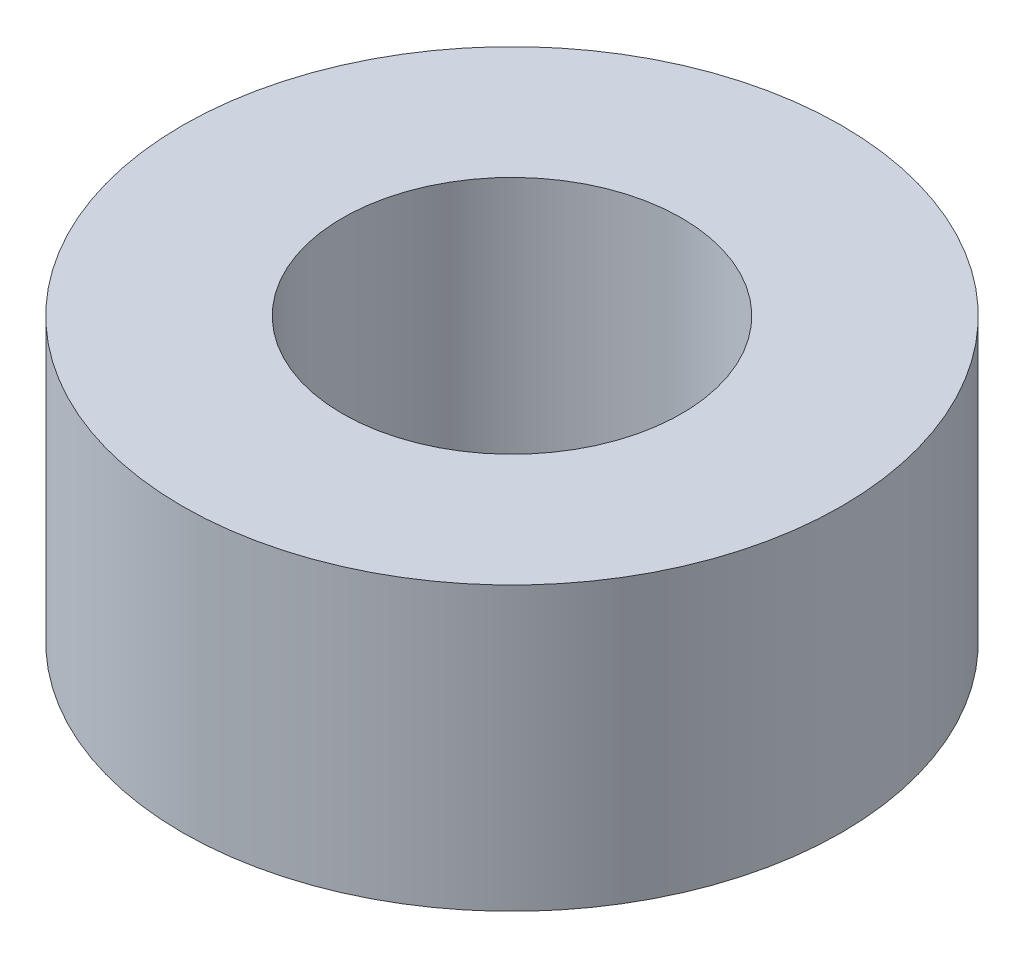
ISO-10303-21;
HEADER;
FILE_DESCRIPTION(('STEP AP214'),'2;1');
FILE_NAME('part.step','',(''),(''),'','','');
FILE_SCHEMA(('AUTOMOTIVE_DESIGN { 1 0 10303 214 1 1 1 1 }'));
ENDSEC;
DATA;
#1=APPLICATION_CONTEXT('core data for automotive mechanical design processes');
#2=APPLICATION_PROTOCOL_DEFINITION('international standard','automotive_design',2000,#1);
#3=PRODUCT_CONTEXT('',#1,'mechanical');
#4=PRODUCT('Part','Part','',(#3));
#5=PRODUCT_RELATED_PRODUCT_CATEGORY('part','',(#4));
#6=PRODUCT_DEFINITION_FORMATION('','',#4);
#7=PRODUCT_DEFINITION_CONTEXT('part definition',#1,'design');
#8=PRODUCT_DEFINITION('design','',#6,#7);
#9=PRODUCT_DEFINITION_SHAPE('','',#8);
#10=(LENGTH_UNIT() NAMED_UNIT(*) SI_UNIT(.MILLI.,.METRE.));
#11=(NAMED_UNIT(*) PLANE_ANGLE_UNIT() SI_UNIT($,.RADIAN.));
#12=(NAMED_UNIT(*) SI_UNIT($,.STERADIAN.) SOLID_ANGLE_UNIT());
#13=UNCERTAINTY_MEASURE_WITH_UNIT(LENGTH_MEASURE(1.E-05),#10,'distance_accuracy_value','');
#14=(GEOMETRIC_REPRESENTATION_CONTEXT(3) GLOBAL_UNCERTAINTY_ASSIGNED_CONTEXT((#13)) GLOBAL_UNIT_ASSIGNED_CONTEXT((#10,
#11,#12)) REPRESENTATION_CONTEXT('',''));
#15=CARTESIAN_POINT('',(0.,0.,0.));
#16=DIRECTION('',(0.,0.,1.));
#17=DIRECTION('',(1.,0.,0.));
#18=AXIS2_PLACEMENT_3D('',#15,#16,#17);
#19=CARTESIAN_POINT('',(0.,3.,0.));
#20=DIRECTION('',(0.,1.,0.));
#21=DIRECTION('',(0.,0.,1.));
#22=AXIS2_PLACEMENT_3D('',#19,#20,#21);
#23=PLANE('',#22);
#24=CARTESIAN_POINT('',(0.,3.,0.));
#25=DIRECTION('',(0.,1.,0.));
#26=DIRECTION('',(0.,0.,1.));
#27=AXIS2_PLACEMENT_3D('',#24,#25,#26);
#28=CIRCLE('',#27,3.5);
#29=CARTESIAN_POINT('',(0.,3.,3.5));
#30=VERTEX_POINT('',#29);
#31=EDGE_CURVE('E10',#30,#30,#28,.T.);
#32=ORIENTED_EDGE('',*,*,#31,.T.);
#33=EDGE_LOOP('',(#32));
#34=FACE_BOUND('',#33,.T.);
#35=CARTESIAN_POINT('',(0.,3.,0.));
#36=DIRECTION('',(0.,1.,0.));
#37=DIRECTION('',(0.,0.,1.));
#38=AXIS2_PLACEMENT_3D('',#35,#36,#37);
#39=CIRCLE('',#38,1.8);
#40=CARTESIAN_POINT('',(0.,3.,1.8));
#41=VERTEX_POINT('',#40);
#42=EDGE_CURVE('E42',#41,#41,#39,.T.);
#43=ORIENTED_EDGE('',*,*,#42,.F.);
#44=EDGE_LOOP('',(#43));
#45=FACE_BOUND('',#44,.T.);
#46=ADVANCED_FACE('F31',(#34,#45),#23,.T.);
#47=CARTESIAN_POINT('',(0.,0.,0.));
#48=DIRECTION('',(0.,1.,0.));
#49=DIRECTION('',(0.,0.,1.));
#50=AXIS2_PLACEMENT_3D('',#47,#48,#49);
#51=PLANE('',#50);
#52=CARTESIAN_POINT('',(0.,0.,0.));
#53=DIRECTION('',(0.,1.,0.));
#54=DIRECTION('',(0.,0.,1.));
#55=AXIS2_PLACEMENT_3D('',#52,#53,#54);
#56=CIRCLE('',#55,3.5);
#57=CARTESIAN_POINT('',(0.,0.,3.5));
#58=VERTEX_POINT('',#57);
#59=EDGE_CURVE('E35',#58,#58,#56,.T.);
#60=ORIENTED_EDGE('',*,*,#59,.F.);
#61=EDGE_LOOP('',(#60));
#62=FACE_BOUND('',#61,.T.);
#63=CARTESIAN_POINT('',(0.,0.,0.));
#64=DIRECTION('',(0.,1.,0.));
#65=DIRECTION('',(0.,0.,1.));
#66=AXIS2_PLACEMENT_3D('',#63,#64,#65);
#67=CIRCLE('',#66,1.8);
#68=CARTESIAN_POINT('',(0.,0.,1.8));
#69=VERTEX_POINT('',#68);
#70=EDGE_CURVE('E44',#69,#69,#67,.T.);
#71=ORIENTED_EDGE('',*,*,#70,.T.);
#72=EDGE_LOOP('',(#71));
#73=FACE_BOUND('',#72,.T.);
#74=ADVANCED_FACE('F54',(#62,#73),#51,.F.);
#75=CARTESIAN_POINT('',(0.,3.,0.));
#76=DIRECTION('',(0.,-1.,0.));
#77=DIRECTION('',(0.,0.,-1.));
#78=AXIS2_PLACEMENT_3D('',#75,#76,#77);
#79=CYLINDRICAL_SURFACE('',#78,3.5);
#80=ORIENTED_EDGE('',*,*,#31,.F.);
#81=EDGE_LOOP('',(#80));
#82=FACE_BOUND('',#81,.T.);
#83=ORIENTED_EDGE('',*,*,#59,.T.);
#84=EDGE_LOOP('',(#83));
#85=FACE_BOUND('',#84,.T.);
#86=ADVANCED_FACE('F33',(#82,#85),#79,.T.);
#87=CARTESIAN_POINT('',(0.,3.,0.));
#88=DIRECTION('',(0.,-1.,0.));
#89=DIRECTION('',(0.,0.,-1.));
#90=AXIS2_PLACEMENT_3D('',#87,#88,#89);
#91=CYLINDRICAL_SURFACE('',#90,1.8);
#92=ORIENTED_EDGE('',*,*,#42,.T.);
#93=EDGE_LOOP('',(#92));
#94=FACE_BOUND('',#93,.T.);
#95=ORIENTED_EDGE('',*,*,#70,.F.);
#96=EDGE_LOOP('',(#95));
#97=FACE_BOUND('',#96,.T.);
#98=ADVANCED_FACE('F50',(#94,#97),#91,.F.);
#99=CLOSED_SHELL('',(#46,#74,#86,#98));
#100=MANIFOLD_SOLID_BREP('B2',#99);
#101=ADVANCED_BREP_SHAPE_REPRESENTATION('',(#18,#100),#14);
#102=SHAPE_DEFINITION_REPRESENTATION(#9,#101);
ENDSEC;
END-ISO-10303-21;
